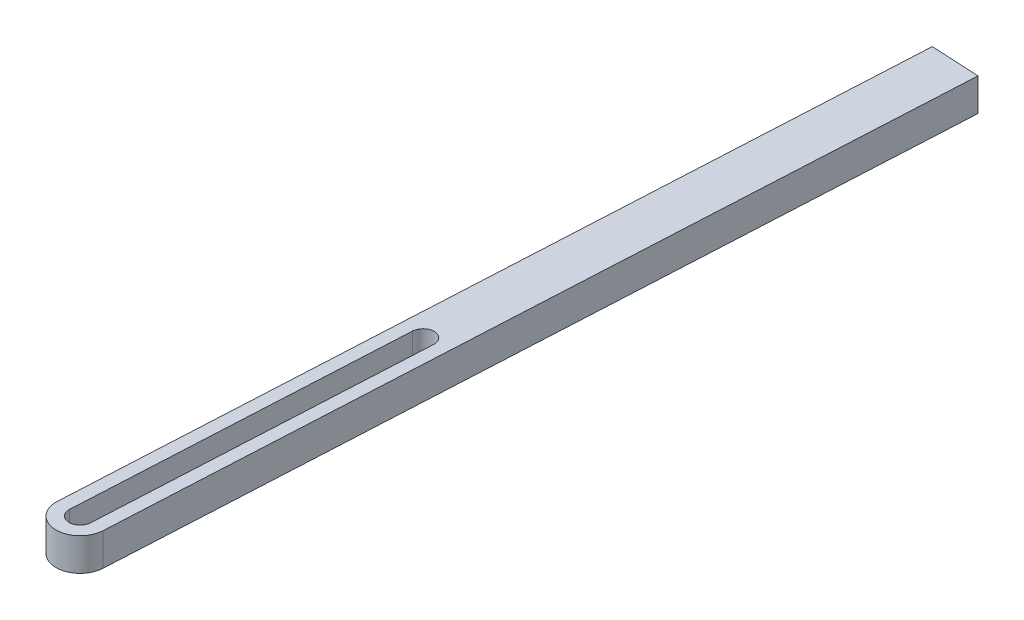
ISO-10303-21;
HEADER;
FILE_DESCRIPTION(('STEP AP214'),'2;1');
FILE_NAME('part.step','',(''),(''),'','','');
FILE_SCHEMA(('AUTOMOTIVE_DESIGN { 1 0 10303 214 1 1 1 1 }'));
ENDSEC;
DATA;
#1=APPLICATION_CONTEXT('core data for automotive mechanical design processes');
#2=APPLICATION_PROTOCOL_DEFINITION('international standard','automotive_design',2000,#1);
#3=PRODUCT_CONTEXT('',#1,'mechanical');
#4=PRODUCT('Part','Part','',(#3));
#5=PRODUCT_RELATED_PRODUCT_CATEGORY('part','',(#4));
#6=PRODUCT_DEFINITION_FORMATION('','',#4);
#7=PRODUCT_DEFINITION_CONTEXT('part definition',#1,'design');
#8=PRODUCT_DEFINITION('design','',#6,#7);
#9=PRODUCT_DEFINITION_SHAPE('','',#8);
#10=(LENGTH_UNIT() NAMED_UNIT(*) SI_UNIT(.MILLI.,.METRE.));
#11=(NAMED_UNIT(*) PLANE_ANGLE_UNIT() SI_UNIT($,.RADIAN.));
#12=(NAMED_UNIT(*) SI_UNIT($,.STERADIAN.) SOLID_ANGLE_UNIT());
#13=UNCERTAINTY_MEASURE_WITH_UNIT(LENGTH_MEASURE(1.E-05),#10,'distance_accuracy_value','');
#14=(GEOMETRIC_REPRESENTATION_CONTEXT(3) GLOBAL_UNCERTAINTY_ASSIGNED_CONTEXT((#13)) GLOBAL_UNIT_ASSIGNED_CONTEXT((#10,
#11,#12)) REPRESENTATION_CONTEXT('',''));
#15=CARTESIAN_POINT('',(0.,0.,0.));
#16=DIRECTION('',(0.,0.,1.));
#17=DIRECTION('',(1.,0.,0.));
#18=AXIS2_PLACEMENT_3D('',#15,#16,#17);
#19=CARTESIAN_POINT('',(-9.82024110292599,0.,187.11250301077));
#20=DIRECTION('',(-0.0524109507479032,0.,0.998625601635418));
#21=DIRECTION('',(0.998625601635418,0.,0.0524109507479032));
#22=AXIS2_PLACEMENT_3D('',#19,#20,#21);
#23=PLANE('',#22);
#24=DIRECTION('',(0.,1.,0.));
#25=VECTOR('',#24,1.);
#26=CARTESIAN_POINT('',(-11.4215991400609,2.5,187.028458803334));
#27=LINE('',#26,#25);
#28=CARTESIAN_POINT('',(-11.4215991400609,-2.5,187.028458803334));
#29=VERTEX_POINT('',#28);
#30=CARTESIAN_POINT('',(-11.4215991400609,2.5,187.028458803334));
#31=VERTEX_POINT('',#30);
#32=EDGE_CURVE('E43',#29,#31,#27,.T.);
#33=ORIENTED_EDGE('',*,*,#32,.T.);
#34=DIRECTION('',(0.998625601635418,0.,0.0524109507479032));
#35=VECTOR('',#34,1.);
#36=CARTESIAN_POINT('',(-9.82024110292599,2.5,187.11250301077));
#37=LINE('',#36,#35);
#38=CARTESIAN_POINT('',(-4.03176968795879,2.5,187.416299838869));
#39=VERTEX_POINT('',#38);
#40=EDGE_CURVE('E11',#31,#39,#37,.T.);
#41=ORIENTED_EDGE('',*,*,#40,.T.);
#42=DIRECTION('',(0.,1.,0.));
#43=VECTOR('',#42,1.);
#44=CARTESIAN_POINT('',(-4.0317696879588,2.5,187.416299838869));
#45=LINE('',#44,#43);
#46=CARTESIAN_POINT('',(-4.03176968795879,-2.5,187.416299838869));
#47=VERTEX_POINT('',#46);
#48=EDGE_CURVE('E57',#47,#39,#45,.T.);
#49=ORIENTED_EDGE('',*,*,#48,.F.);
#50=DIRECTION('',(0.998625601635418,0.,0.0524109507479032));
#51=VECTOR('',#50,1.);
#52=CARTESIAN_POINT('',(-9.82024110292599,-2.5,187.11250301077));
#53=LINE('',#52,#51);
#54=EDGE_CURVE('E38',#29,#47,#53,.T.);
#55=ORIENTED_EDGE('',*,*,#54,.F.);
#56=EDGE_LOOP('',(#33,#41,#49,#55));
#57=FACE_BOUND('',#56,.T.);
#58=ADVANCED_FACE('F35',(#57),#23,.F.);
#59=CARTESIAN_POINT('',(3.79122021169661,2.5,0.198974926603408));
#60=DIRECTION('',(-0.998625601635418,0.,-0.0524109507479046));
#61=DIRECTION('',(-0.0524109507479046,0.,0.998625601635418));
#62=AXIS2_PLACEMENT_3D('',#59,#60,#61);
#63=PLANE('',#62);
#64=DIRECTION('',(0.0524109507479046,0.,-0.998625601635418));
#65=VECTOR('',#64,1.);
#66=CARTESIAN_POINT('',(3.79122021169661,-2.5,0.198974926603408));
#67=LINE('',#66,#65);
#68=CARTESIAN_POINT('',(-12.7153479328936,-2.5,314.711139066011));
#69=VERTEX_POINT('',#68);
#70=CARTESIAN_POINT('',(-10.0948003954983,-2.5,264.77985898424));
#71=VERTEX_POINT('',#70);
#72=EDGE_CURVE('E148',#69,#71,#67,.T.);
#73=ORIENTED_EDGE('',*,*,#72,.F.);
#74=DIRECTION('',(0.,-1.,0.));
#75=VECTOR('',#74,1.);
#76=CARTESIAN_POINT('',(-12.7153479328936,2.5,314.711139066011));
#77=LINE('',#76,#75);
#78=CARTESIAN_POINT('',(-12.7153479328936,2.5,314.711139066011));
#79=VERTEX_POINT('',#78);
#80=EDGE_CURVE('E156',#79,#69,#77,.T.);
#81=ORIENTED_EDGE('',*,*,#80,.F.);
#82=DIRECTION('',(0.0524109507479046,0.,-0.998625601635418));
#83=VECTOR('',#82,1.);
#84=CARTESIAN_POINT('',(3.79122021169661,2.5,0.198974926603408));
#85=LINE('',#84,#83);
#86=CARTESIAN_POINT('',(-10.0948003954983,2.5,264.77985898424));
#87=VERTEX_POINT('',#86);
#88=EDGE_CURVE('E132',#79,#87,#85,.T.);
#89=ORIENTED_EDGE('',*,*,#88,.T.);
#90=DIRECTION('',(0.,-1.,0.));
#91=VECTOR('',#90,1.);
#92=CARTESIAN_POINT('',(-10.0948003954983,2.5,264.77985898424));
#93=LINE('',#92,#91);
#94=EDGE_CURVE('E158',#87,#71,#93,.T.);
#95=ORIENTED_EDGE('',*,*,#94,.T.);
#96=EDGE_LOOP('',(#73,#81,#89,#95));
#97=FACE_BOUND('',#96,.T.);
#98=ADVANCED_FACE('F177',(#97),#63,.T.);
#99=CARTESIAN_POINT('',(-14.4130114556738,2.5,314.62204044974));
#100=DIRECTION('',(0.,-1.,0.));
#101=DIRECTION('',(0.,0.,-1.));
#102=AXIS2_PLACEMENT_3D('',#99,#100,#101);
#103=CYLINDRICAL_SURFACE('',#102,1.7);
#104=CARTESIAN_POINT('',(-14.4130114556738,-2.5,314.62204044974));
#105=DIRECTION('',(0.,1.,0.));
#106=DIRECTION('',(0.,0.,1.));
#107=AXIS2_PLACEMENT_3D('',#104,#105,#106);
#108=CIRCLE('',#107,1.7);
#109=CARTESIAN_POINT('',(-16.110674978454,-2.5,314.532941833468));
#110=VERTEX_POINT('',#109);
#111=EDGE_CURVE('E125',#110,#69,#108,.T.);
#112=ORIENTED_EDGE('',*,*,#111,.F.);
#113=DIRECTION('',(0.,-1.,0.));
#114=VECTOR('',#113,1.);
#115=CARTESIAN_POINT('',(-16.110674978454,2.5,314.532941833468));
#116=LINE('',#115,#114);
#117=CARTESIAN_POINT('',(-16.110674978454,2.5,314.532941833468));
#118=VERTEX_POINT('',#117);
#119=EDGE_CURVE('E154',#118,#110,#116,.T.);
#120=ORIENTED_EDGE('',*,*,#119,.F.);
#121=CARTESIAN_POINT('',(-14.4130114556738,2.5,314.62204044974));
#122=DIRECTION('',(0.,1.,0.));
#123=DIRECTION('',(0.,0.,1.));
#124=AXIS2_PLACEMENT_3D('',#121,#122,#123);
#125=CIRCLE('',#124,1.7);
#126=EDGE_CURVE('E135',#118,#79,#125,.T.);
#127=ORIENTED_EDGE('',*,*,#126,.T.);
#128=ORIENTED_EDGE('',*,*,#80,.T.);
#129=EDGE_LOOP('',(#112,#120,#127,#128));
#130=FACE_BOUND('',#129,.T.);
#131=ADVANCED_FACE('F181',(#130),#103,.F.);
#132=CARTESIAN_POINT('',(0.395893166136205,2.5,0.0207776940605332));
#133=DIRECTION('',(-0.998625601635418,0.,-0.0524109507479046));
#134=DIRECTION('',(-0.0524109507479046,0.,0.998625601635418));
#135=AXIS2_PLACEMENT_3D('',#132,#133,#134);
#136=PLANE('',#135);
#137=DIRECTION('',(0.0524109507479046,0.,-0.998625601635418));
#138=VECTOR('',#137,1.);
#139=CARTESIAN_POINT('',(0.395893166136205,-2.5,0.0207776940605332));
#140=LINE('',#139,#138);
#141=CARTESIAN_POINT('',(-13.4901274410588,-2.5,264.601661751698));
#142=VERTEX_POINT('',#141);
#143=EDGE_CURVE('E122',#110,#142,#140,.T.);
#144=ORIENTED_EDGE('',*,*,#143,.T.);
#145=DIRECTION('',(0.,-1.,0.));
#146=VECTOR('',#145,1.);
#147=CARTESIAN_POINT('',(-13.4901274410588,2.5,264.601661751698));
#148=LINE('',#147,#146);
#149=CARTESIAN_POINT('',(-13.4901274410588,2.5,264.601661751698));
#150=VERTEX_POINT('',#149);
#151=EDGE_CURVE('E111',#150,#142,#148,.T.);
#152=ORIENTED_EDGE('',*,*,#151,.F.);
#153=DIRECTION('',(0.0524109507479046,0.,-0.998625601635418));
#154=VECTOR('',#153,1.);
#155=CARTESIAN_POINT('',(0.395893166136205,2.5,0.0207776940605332));
#156=LINE('',#155,#154);
#157=EDGE_CURVE('E138',#118,#150,#156,.T.);
#158=ORIENTED_EDGE('',*,*,#157,.F.);
#159=ORIENTED_EDGE('',*,*,#119,.T.);
#160=EDGE_LOOP('',(#144,#152,#158,#159));
#161=FACE_BOUND('',#160,.T.);
#162=ADVANCED_FACE('F189',(#161),#136,.F.);
#163=CARTESIAN_POINT('',(-11.7924639182785,2.5,264.690760367969));
#164=DIRECTION('',(0.,-1.,0.));
#165=DIRECTION('',(0.,0.,-1.));
#166=AXIS2_PLACEMENT_3D('',#163,#164,#165);
#167=CYLINDRICAL_SURFACE('',#166,1.7);
#168=CARTESIAN_POINT('',(-11.7924639182785,-2.5,264.690760367969));
#169=DIRECTION('',(0.,1.,0.));
#170=DIRECTION('',(0.,0.,1.));
#171=AXIS2_PLACEMENT_3D('',#168,#169,#170);
#172=CIRCLE('',#171,1.7);
#173=EDGE_CURVE('E145',#71,#142,#172,.T.);
#174=ORIENTED_EDGE('',*,*,#173,.F.);
#175=ORIENTED_EDGE('',*,*,#94,.F.);
#176=CARTESIAN_POINT('',(-11.7924639182785,2.5,264.690760367969));
#177=DIRECTION('',(0.,1.,0.));
#178=DIRECTION('',(0.,0.,1.));
#179=AXIS2_PLACEMENT_3D('',#176,#177,#178);
#180=CIRCLE('',#179,1.7);
#181=EDGE_CURVE('E129',#87,#150,#180,.T.);
#182=ORIENTED_EDGE('',*,*,#181,.T.);
#183=ORIENTED_EDGE('',*,*,#151,.T.);
#184=EDGE_LOOP('',(#174,#175,#182,#183));
#185=FACE_BOUND('',#184,.T.);
#186=ADVANCED_FACE('F192',(#185),#167,.F.);
#187=CARTESIAN_POINT('',(-1.6013580371346,2.5,-0.0840442074352746));
#188=DIRECTION('',(-0.998625601635418,0.,-0.0524109507479048));
#189=DIRECTION('',(-0.0524109507479048,0.,0.998625601635418));
#190=AXIS2_PLACEMENT_3D('',#187,#188,#189);
#191=PLANE('',#190);
#192=ORIENTED_EDGE('',*,*,#32,.F.);
#193=DIRECTION('',(0.0524109507479048,0.,-0.998625601635418));
#194=VECTOR('',#193,1.);
#195=CARTESIAN_POINT('',(-1.6013580371346,-2.5,-0.0840442074352746));
#196=LINE('',#195,#194);
#197=CARTESIAN_POINT('',(-18.1079261817248,-2.5,314.428119931973));
#198=VERTEX_POINT('',#197);
#199=EDGE_CURVE('E108',#198,#29,#196,.T.);
#200=ORIENTED_EDGE('',*,*,#199,.F.);
#201=DIRECTION('',(0.,-1.,0.));
#202=VECTOR('',#201,1.);
#203=CARTESIAN_POINT('',(-18.1079261817248,2.5,314.428119931973));
#204=LINE('',#203,#202);
#205=CARTESIAN_POINT('',(-18.1079261817248,2.5,314.428119931973));
#206=VERTEX_POINT('',#205);
#207=EDGE_CURVE('E102',#206,#198,#204,.T.);
#208=ORIENTED_EDGE('',*,*,#207,.F.);
#209=DIRECTION('',(0.0524109507479048,0.,-0.998625601635418));
#210=VECTOR('',#209,1.);
#211=CARTESIAN_POINT('',(-1.6013580371346,2.5,-0.0840442074352746));
#212=LINE('',#211,#210);
#213=EDGE_CURVE('E106',#206,#31,#212,.T.);
#214=ORIENTED_EDGE('',*,*,#213,.T.);
#215=EDGE_LOOP('',(#192,#200,#208,#214));
#216=FACE_BOUND('',#215,.T.);
#217=ADVANCED_FACE('F105',(#216),#191,.T.);
#218=CARTESIAN_POINT('',(-14.4130114556738,2.5,314.62204044974));
#219=DIRECTION('',(0.,-1.,0.));
#220=DIRECTION('',(0.,0.,-1.));
#221=AXIS2_PLACEMENT_3D('',#218,#219,#220);
#222=CYLINDRICAL_SURFACE('',#221,3.7);
#223=CARTESIAN_POINT('',(-14.4130114556738,-2.5,314.62204044974));
#224=DIRECTION('',(0.,1.,0.));
#225=DIRECTION('',(0.,0.,1.));
#226=AXIS2_PLACEMENT_3D('',#223,#224,#225);
#227=CIRCLE('',#226,3.7);
#228=CARTESIAN_POINT('',(-10.7180967296227,-2.5,314.815960967507));
#229=VERTEX_POINT('',#228);
#230=EDGE_CURVE('E141',#198,#229,#227,.T.);
#231=ORIENTED_EDGE('',*,*,#230,.T.);
#232=DIRECTION('',(0.,-1.,0.));
#233=VECTOR('',#232,1.);
#234=CARTESIAN_POINT('',(-10.7180967296227,2.5,314.815960967507));
#235=LINE('',#234,#233);
#236=CARTESIAN_POINT('',(-10.7180967296227,2.5,314.815960967507));
#237=VERTEX_POINT('',#236);
#238=EDGE_CURVE('E112',#237,#229,#235,.T.);
#239=ORIENTED_EDGE('',*,*,#238,.F.);
#240=CARTESIAN_POINT('',(-14.4130114556738,2.5,314.62204044974));
#241=DIRECTION('',(0.,1.,0.));
#242=DIRECTION('',(0.,0.,1.));
#243=AXIS2_PLACEMENT_3D('',#240,#241,#242);
#244=CIRCLE('',#243,3.7);
#245=EDGE_CURVE('E115',#206,#237,#244,.T.);
#246=ORIENTED_EDGE('',*,*,#245,.F.);
#247=ORIENTED_EDGE('',*,*,#207,.T.);
#248=EDGE_LOOP('',(#231,#239,#246,#247));
#249=FACE_BOUND('',#248,.T.);
#250=ADVANCED_FACE('F116',(#249),#222,.T.);
#251=CARTESIAN_POINT('',(5.78847141496748,2.5,0.303796828099219));
#252=DIRECTION('',(-0.998625601635418,0.,-0.0524109507479047));
#253=DIRECTION('',(-0.0524109507479047,0.,0.998625601635418));
#254=AXIS2_PLACEMENT_3D('',#251,#252,#253);
#255=PLANE('',#254);
#256=DIRECTION('',(0.0524109507479047,0.,-0.998625601635418));
#257=VECTOR('',#256,1.);
#258=CARTESIAN_POINT('',(5.78847141496748,-2.5,0.303796828099219));
#259=LINE('',#258,#257);
#260=EDGE_CURVE('E143',#229,#47,#259,.T.);
#261=ORIENTED_EDGE('',*,*,#260,.T.);
#262=ORIENTED_EDGE('',*,*,#48,.T.);
#263=DIRECTION('',(0.0524109507479047,0.,-0.998625601635418));
#264=VECTOR('',#263,1.);
#265=CARTESIAN_POINT('',(5.78847141496748,2.5,0.303796828099219));
#266=LINE('',#265,#264);
#267=EDGE_CURVE('E118',#237,#39,#266,.T.);
#268=ORIENTED_EDGE('',*,*,#267,.F.);
#269=ORIENTED_EDGE('',*,*,#238,.T.);
#270=EDGE_LOOP('',(#261,#262,#268,#269));
#271=FACE_BOUND('',#270,.T.);
#272=ADVANCED_FACE('F166',(#271),#255,.F.);
#273=CARTESIAN_POINT('',(0.,-2.5,0.));
#274=DIRECTION('',(0.,1.,0.));
#275=DIRECTION('',(0.,0.,1.));
#276=AXIS2_PLACEMENT_3D('',#273,#274,#275);
#277=PLANE('',#276);
#278=ORIENTED_EDGE('',*,*,#199,.T.);
#279=ORIENTED_EDGE('',*,*,#54,.T.);
#280=ORIENTED_EDGE('',*,*,#260,.F.);
#281=ORIENTED_EDGE('',*,*,#230,.F.);
#282=EDGE_LOOP('',(#278,#279,#280,#281));
#283=FACE_BOUND('',#282,.T.);
#284=ORIENTED_EDGE('',*,*,#173,.T.);
#285=ORIENTED_EDGE('',*,*,#143,.F.);
#286=ORIENTED_EDGE('',*,*,#111,.T.);
#287=ORIENTED_EDGE('',*,*,#72,.T.);
#288=EDGE_LOOP('',(#284,#285,#286,#287));
#289=FACE_BOUND('',#288,.T.);
#290=ADVANCED_FACE('F163',(#283,#289),#277,.F.);
#291=CARTESIAN_POINT('',(0.,2.5,0.));
#292=DIRECTION('',(0.,1.,0.));
#293=DIRECTION('',(0.,0.,1.));
#294=AXIS2_PLACEMENT_3D('',#291,#292,#293);
#295=PLANE('',#294);
#296=ORIENTED_EDGE('',*,*,#40,.F.);
#297=ORIENTED_EDGE('',*,*,#213,.F.);
#298=ORIENTED_EDGE('',*,*,#245,.T.);
#299=ORIENTED_EDGE('',*,*,#267,.T.);
#300=EDGE_LOOP('',(#296,#297,#298,#299));
#301=FACE_BOUND('',#300,.T.);
#302=ORIENTED_EDGE('',*,*,#181,.F.);
#303=ORIENTED_EDGE('',*,*,#88,.F.);
#304=ORIENTED_EDGE('',*,*,#126,.F.);
#305=ORIENTED_EDGE('',*,*,#157,.T.);
#306=EDGE_LOOP('',(#302,#303,#304,#305));
#307=FACE_BOUND('',#306,.T.);
#308=ADVANCED_FACE('F120',(#301,#307),#295,.T.);
#309=CLOSED_SHELL('',(#58,#98,#131,#162,#186,#217,#250,#272,#290,#308));
#310=MANIFOLD_SOLID_BREP('B2',#309);
#311=ADVANCED_BREP_SHAPE_REPRESENTATION('',(#18,#310),#14);
#312=SHAPE_DEFINITION_REPRESENTATION(#9,#311);
ENDSEC;
END-ISO-10303-21;
